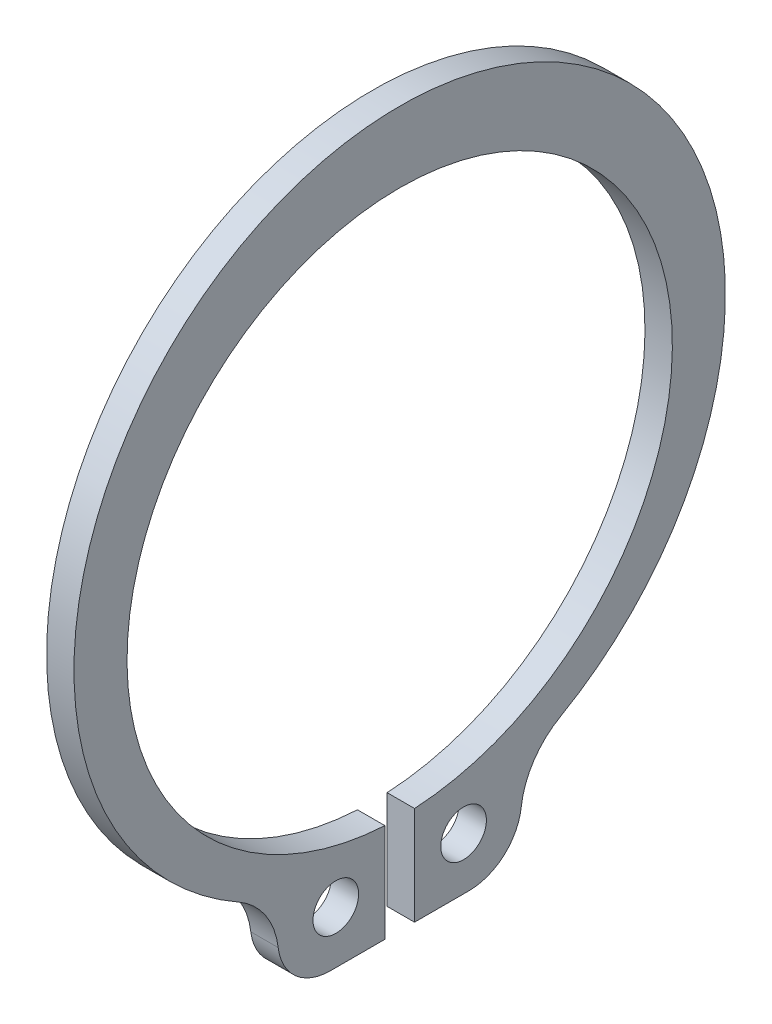
ISO-10303-21;
HEADER;
FILE_DESCRIPTION(('STEP AP214'),'2;1');
FILE_NAME('part.step','',(''),(''),'','','');
FILE_SCHEMA(('AUTOMOTIVE_DESIGN { 1 0 10303 214 1 1 1 1 }'));
ENDSEC;
DATA;
#1=APPLICATION_CONTEXT('core data for automotive mechanical design processes');
#2=APPLICATION_PROTOCOL_DEFINITION('international standard','automotive_design',2000,#1);
#3=PRODUCT_CONTEXT('',#1,'mechanical');
#4=PRODUCT('Part','Part','',(#3));
#5=PRODUCT_RELATED_PRODUCT_CATEGORY('part','',(#4));
#6=PRODUCT_DEFINITION_FORMATION('','',#4);
#7=PRODUCT_DEFINITION_CONTEXT('part definition',#1,'design');
#8=PRODUCT_DEFINITION('design','',#6,#7);
#9=PRODUCT_DEFINITION_SHAPE('','',#8);
#10=(LENGTH_UNIT() NAMED_UNIT(*) SI_UNIT(.MILLI.,.METRE.));
#11=(NAMED_UNIT(*) PLANE_ANGLE_UNIT() SI_UNIT($,.RADIAN.));
#12=(NAMED_UNIT(*) SI_UNIT($,.STERADIAN.) SOLID_ANGLE_UNIT());
#13=UNCERTAINTY_MEASURE_WITH_UNIT(LENGTH_MEASURE(1.E-05),#10,'distance_accuracy_value','');
#14=(GEOMETRIC_REPRESENTATION_CONTEXT(3) GLOBAL_UNCERTAINTY_ASSIGNED_CONTEXT((#13)) GLOBAL_UNIT_ASSIGNED_CONTEXT((#10,
#11,#12)) REPRESENTATION_CONTEXT('',''));
#15=CARTESIAN_POINT('',(0.,0.,0.));
#16=DIRECTION('',(0.,0.,1.));
#17=DIRECTION('',(1.,0.,0.));
#18=AXIS2_PLACEMENT_3D('',#15,#16,#17);
#19=CARTESIAN_POINT('',(-0.6,-14.6397048301289,-8.74999999999999));
#20=DIRECTION('',(1.,0.,0.));
#21=DIRECTION('',(0.,0.,-1.));
#22=AXIS2_PLACEMENT_3D('',#19,#20,#21);
#23=PLANE('',#22);
#24=CARTESIAN_POINT('',(-0.6,-13.95,2.8));
#25=DIRECTION('',(1.,0.,0.));
#26=DIRECTION('',(0.,0.,-1.));
#27=AXIS2_PLACEMENT_3D('',#24,#25,#26);
#28=CIRCLE('',#27,1.);
#29=CARTESIAN_POINT('',(-0.6,-13.95,1.8));
#30=VERTEX_POINT('',#29);
#31=EDGE_CURVE('E161',#30,#30,#28,.T.);
#32=ORIENTED_EDGE('',*,*,#31,.T.);
#33=EDGE_LOOP('',(#32));
#34=FACE_BOUND('',#33,.T.);
#35=CARTESIAN_POINT('',(-0.6,-13.95,-3.04151445238785));
#36=DIRECTION('',(1.,0.,0.));
#37=DIRECTION('',(0.,0.,-1.));
#38=AXIS2_PLACEMENT_3D('',#35,#36,#37);
#39=CIRCLE('',#38,2.29999999999999);
#40=CARTESIAN_POINT('',(-0.6,-16.25,-3.04151445238785));
#41=VERTEX_POINT('',#40);
#42=CARTESIAN_POINT('',(-0.6,-14.2258819320516,-5.3249086714327));
#43=VERTEX_POINT('',#42);
#44=EDGE_CURVE('E117',#41,#43,#39,.T.);
#45=ORIENTED_EDGE('',*,*,#44,.F.);
#46=DIRECTION('',(0.,0.,1.));
#47=VECTOR('',#46,1.);
#48=CARTESIAN_POINT('',(-0.6,-16.25,-0.65));
#49=LINE('',#48,#47);
#50=CARTESIAN_POINT('',(-0.6,-16.25,-0.65));
#51=VERTEX_POINT('',#50);
#52=EDGE_CURVE('E114',#41,#51,#49,.T.);
#53=ORIENTED_EDGE('',*,*,#52,.T.);
#54=DIRECTION('',(0.,1.,0.));
#55=VECTOR('',#54,1.);
#56=CARTESIAN_POINT('',(-0.6,-11.9323090808108,-0.65));
#57=LINE('',#56,#55);
#58=CARTESIAN_POINT('',(-0.6,-11.9323090808108,-0.65));
#59=VERTEX_POINT('',#58);
#60=EDGE_CURVE('E121',#51,#59,#57,.T.);
#61=ORIENTED_EDGE('',*,*,#60,.T.);
#62=CARTESIAN_POINT('',(-0.6,0.,0.));
#63=DIRECTION('',(1.,0.,0.));
#64=DIRECTION('',(0.,0.,-1.));
#65=AXIS2_PLACEMENT_3D('',#62,#63,#64);
#66=CIRCLE('',#65,11.95);
#67=CARTESIAN_POINT('',(-0.6,-11.9323090808108,0.650000000000002));
#68=VERTEX_POINT('',#67);
#69=EDGE_CURVE('E165',#59,#68,#66,.T.);
#70=ORIENTED_EDGE('',*,*,#69,.T.);
#71=DIRECTION('',(0.,-1.,0.));
#72=VECTOR('',#71,1.);
#73=CARTESIAN_POINT('',(-0.6,-16.25,0.65));
#74=LINE('',#73,#72);
#75=CARTESIAN_POINT('',(-0.6,-16.25,0.65));
#76=VERTEX_POINT('',#75);
#77=EDGE_CURVE('E127',#68,#76,#74,.T.);
#78=ORIENTED_EDGE('',*,*,#77,.T.);
#79=DIRECTION('',(0.,0.,1.));
#80=VECTOR('',#79,1.);
#81=CARTESIAN_POINT('',(-0.6,-16.25,3.04151445238785));
#82=LINE('',#81,#80);
#83=CARTESIAN_POINT('',(-0.6,-16.25,3.04151445238784));
#84=VERTEX_POINT('',#83);
#85=EDGE_CURVE('E134',#76,#84,#82,.T.);
#86=ORIENTED_EDGE('',*,*,#85,.T.);
#87=CARTESIAN_POINT('',(-0.6,-13.95,3.04151445238784));
#88=DIRECTION('',(1.,0.,0.));
#89=DIRECTION('',(0.,0.,-1.));
#90=AXIS2_PLACEMENT_3D('',#87,#88,#89);
#91=CIRCLE('',#90,2.3);
#92=CARTESIAN_POINT('',(-0.6,-14.2258819320516,5.3249086714327));
#93=VERTEX_POINT('',#92);
#94=EDGE_CURVE('E168',#93,#84,#91,.T.);
#95=ORIENTED_EDGE('',*,*,#94,.F.);
#96=CARTESIAN_POINT('',(-0.6,-14.6397048301289,8.75));
#97=DIRECTION('',(1.,0.,0.));
#98=DIRECTION('',(0.,0.,-1.));
#99=AXIS2_PLACEMENT_3D('',#96,#97,#98);
#100=CIRCLE('',#99,3.45);
#101=CARTESIAN_POINT('',(-0.6,-11.6393814640389,7.04689703808182));
#102=VERTEX_POINT('',#101);
#103=EDGE_CURVE('E93',#93,#102,#100,.T.);
#104=ORIENTED_EDGE('',*,*,#103,.T.);
#105=CARTESIAN_POINT('',(-0.6,0.775,0.));
#106=DIRECTION('',(1.,0.,0.));
#107=DIRECTION('',(0.,0.,-1.));
#108=AXIS2_PLACEMENT_3D('',#105,#106,#107);
#109=CIRCLE('',#108,14.275);
#110=CARTESIAN_POINT('',(-0.6,-11.6393815069315,-7.04689696251891));
#111=VERTEX_POINT('',#110);
#112=EDGE_CURVE('E87',#111,#102,#109,.T.);
#113=ORIENTED_EDGE('',*,*,#112,.F.);
#114=CARTESIAN_POINT('',(-0.6,-14.6397048301289,-8.74999999999999));
#115=DIRECTION('',(1.,0.,0.));
#116=DIRECTION('',(0.,0.,-1.));
#117=AXIS2_PLACEMENT_3D('',#114,#115,#116);
#118=CIRCLE('',#117,3.44999999999999);
#119=EDGE_CURVE('E90',#111,#43,#118,.T.);
#120=ORIENTED_EDGE('',*,*,#119,.T.);
#121=EDGE_LOOP('',(#45,#53,#61,#70,#78,#86,#95,#104,#113,#120));
#122=FACE_BOUND('',#121,.T.);
#123=CARTESIAN_POINT('',(-0.6,-13.95,-2.8));
#124=DIRECTION('',(1.,0.,0.));
#125=DIRECTION('',(0.,0.,-1.));
#126=AXIS2_PLACEMENT_3D('',#123,#124,#125);
#127=CIRCLE('',#126,1.);
#128=CARTESIAN_POINT('',(-0.6,-13.95,-3.8));
#129=VERTEX_POINT('',#128);
#130=EDGE_CURVE('E19',#129,#129,#127,.T.);
#131=ORIENTED_EDGE('',*,*,#130,.T.);
#132=EDGE_LOOP('',(#131));
#133=FACE_BOUND('',#132,.T.);
#134=ADVANCED_FACE('F16',(#34,#122,#133),#23,.F.);
#135=CARTESIAN_POINT('',(0.6,-13.95,-2.8));
#136=DIRECTION('',(1.,0.,0.));
#137=DIRECTION('',(0.,0.,-1.));
#138=AXIS2_PLACEMENT_3D('',#135,#136,#137);
#139=CYLINDRICAL_SURFACE('',#138,1.);
#140=ORIENTED_EDGE('',*,*,#130,.F.);
#141=EDGE_LOOP('',(#140));
#142=FACE_BOUND('',#141,.T.);
#143=CARTESIAN_POINT('',(0.6,-13.95,-2.8));
#144=DIRECTION('',(1.,0.,0.));
#145=DIRECTION('',(0.,0.,-1.));
#146=AXIS2_PLACEMENT_3D('',#143,#144,#145);
#147=CIRCLE('',#146,1.);
#148=CARTESIAN_POINT('',(0.6,-13.95,-3.8));
#149=VERTEX_POINT('',#148);
#150=EDGE_CURVE('E158',#149,#149,#147,.F.);
#151=ORIENTED_EDGE('',*,*,#150,.F.);
#152=EDGE_LOOP('',(#151));
#153=FACE_BOUND('',#152,.T.);
#154=ADVANCED_FACE('F326',(#142,#153),#139,.F.);
#155=CARTESIAN_POINT('',(0.6,-14.6397048301289,-8.74999999999999));
#156=DIRECTION('',(1.,0.,0.));
#157=DIRECTION('',(0.,0.,-1.));
#158=AXIS2_PLACEMENT_3D('',#155,#156,#157);
#159=CYLINDRICAL_SURFACE('',#158,3.44999999999999);
#160=DIRECTION('',(1.,0.,0.));
#161=VECTOR('',#160,1.);
#162=CARTESIAN_POINT('',(0.6,-11.639381549824,-7.046896886956));
#163=LINE('',#162,#161);
#164=CARTESIAN_POINT('',(0.6,-11.6393815069315,-7.04689696251891));
#165=VERTEX_POINT('',#164);
#166=EDGE_CURVE('E97',#165,#111,#163,.F.);
#167=ORIENTED_EDGE('',*,*,#166,.F.);
#168=CARTESIAN_POINT('',(0.6,-14.6397048301289,-8.74999999999999));
#169=DIRECTION('',(1.,0.,0.));
#170=DIRECTION('',(0.,0.,-1.));
#171=AXIS2_PLACEMENT_3D('',#168,#169,#170);
#172=CIRCLE('',#171,3.44999999999999);
#173=CARTESIAN_POINT('',(0.6,-14.2258819320516,-5.3249086714327));
#174=VERTEX_POINT('',#173);
#175=EDGE_CURVE('E156',#174,#165,#172,.F.);
#176=ORIENTED_EDGE('',*,*,#175,.F.);
#177=DIRECTION('',(1.,0.,0.));
#178=VECTOR('',#177,1.);
#179=CARTESIAN_POINT('',(0.6,-14.2258819320516,-5.3249086714327));
#180=LINE('',#179,#178);
#181=EDGE_CURVE('E103',#43,#174,#180,.T.);
#182=ORIENTED_EDGE('',*,*,#181,.F.);
#183=ORIENTED_EDGE('',*,*,#119,.F.);
#184=EDGE_LOOP('',(#167,#176,#182,#183));
#185=FACE_BOUND('',#184,.T.);
#186=ADVANCED_FACE('F100',(#185),#159,.F.);
#187=CARTESIAN_POINT('',(0.6,0.775,0.));
#188=DIRECTION('',(1.,0.,0.));
#189=DIRECTION('',(0.,0.,-1.));
#190=AXIS2_PLACEMENT_3D('',#187,#188,#189);
#191=CYLINDRICAL_SURFACE('',#190,14.275);
#192=CARTESIAN_POINT('',(0.6,0.775,0.));
#193=DIRECTION('',(1.,0.,0.));
#194=DIRECTION('',(0.,0.,-1.));
#195=AXIS2_PLACEMENT_3D('',#192,#193,#194);
#196=CIRCLE('',#195,14.275);
#197=CARTESIAN_POINT('',(0.6,-11.6393814640389,7.04689703808181));
#198=VERTEX_POINT('',#197);
#199=EDGE_CURVE('E107',#165,#198,#196,.T.);
#200=ORIENTED_EDGE('',*,*,#199,.F.);
#201=ORIENTED_EDGE('',*,*,#166,.T.);
#202=ORIENTED_EDGE('',*,*,#112,.T.);
#203=DIRECTION('',(1.,0.,0.));
#204=VECTOR('',#203,1.);
#205=CARTESIAN_POINT('',(0.6,-11.6393814640389,7.04689703808182));
#206=LINE('',#205,#204);
#207=EDGE_CURVE('E109',#102,#198,#206,.T.);
#208=ORIENTED_EDGE('',*,*,#207,.T.);
#209=EDGE_LOOP('',(#200,#201,#202,#208));
#210=FACE_BOUND('',#209,.T.);
#211=ADVANCED_FACE('F105',(#210),#191,.T.);
#212=CARTESIAN_POINT('',(0.6,-14.6397048301289,8.75));
#213=DIRECTION('',(1.,0.,0.));
#214=DIRECTION('',(0.,0.,-1.));
#215=AXIS2_PLACEMENT_3D('',#212,#213,#214);
#216=CYLINDRICAL_SURFACE('',#215,3.45);
#217=DIRECTION('',(1.,0.,0.));
#218=VECTOR('',#217,1.);
#219=CARTESIAN_POINT('',(0.6,-14.2258819320516,5.3249086714327));
#220=LINE('',#219,#218);
#221=CARTESIAN_POINT('',(0.6,-14.2258819320516,5.3249086714327));
#222=VERTEX_POINT('',#221);
#223=EDGE_CURVE('E170',#222,#93,#220,.F.);
#224=ORIENTED_EDGE('',*,*,#223,.F.);
#225=CARTESIAN_POINT('',(0.6,-14.6397048301289,8.75));
#226=DIRECTION('',(1.,0.,0.));
#227=DIRECTION('',(0.,0.,-1.));
#228=AXIS2_PLACEMENT_3D('',#225,#226,#227);
#229=CIRCLE('',#228,3.45);
#230=EDGE_CURVE('E152',#198,#222,#229,.F.);
#231=ORIENTED_EDGE('',*,*,#230,.F.);
#232=ORIENTED_EDGE('',*,*,#207,.F.);
#233=ORIENTED_EDGE('',*,*,#103,.F.);
#234=EDGE_LOOP('',(#224,#231,#232,#233));
#235=FACE_BOUND('',#234,.T.);
#236=ADVANCED_FACE('F300',(#235),#216,.F.);
#237=CARTESIAN_POINT('',(0.6,-13.95,3.04151445238784));
#238=DIRECTION('',(1.,0.,0.));
#239=DIRECTION('',(0.,0.,-1.));
#240=AXIS2_PLACEMENT_3D('',#237,#238,#239);
#241=CYLINDRICAL_SURFACE('',#240,2.3);
#242=CARTESIAN_POINT('',(0.6,-13.95,3.04151445238784));
#243=DIRECTION('',(1.,0.,0.));
#244=DIRECTION('',(0.,0.,-1.));
#245=AXIS2_PLACEMENT_3D('',#242,#243,#244);
#246=CIRCLE('',#245,2.3);
#247=CARTESIAN_POINT('',(0.6,-16.25,3.04151445238784));
#248=VERTEX_POINT('',#247);
#249=EDGE_CURVE('E148',#222,#248,#246,.T.);
#250=ORIENTED_EDGE('',*,*,#249,.F.);
#251=ORIENTED_EDGE('',*,*,#223,.T.);
#252=ORIENTED_EDGE('',*,*,#94,.T.);
#253=DIRECTION('',(1.,0.,0.));
#254=VECTOR('',#253,1.);
#255=CARTESIAN_POINT('',(0.6,-16.25,3.04151445238784));
#256=LINE('',#255,#254);
#257=EDGE_CURVE('E137',#84,#248,#256,.T.);
#258=ORIENTED_EDGE('',*,*,#257,.T.);
#259=EDGE_LOOP('',(#250,#251,#252,#258));
#260=FACE_BOUND('',#259,.T.);
#261=ADVANCED_FACE('F290',(#260),#241,.T.);
#262=CARTESIAN_POINT('',(0.6,-16.25,3.04151445238785));
#263=DIRECTION('',(0.,1.,0.));
#264=DIRECTION('',(0.,0.,1.));
#265=AXIS2_PLACEMENT_3D('',#262,#263,#264);
#266=PLANE('',#265);
#267=DIRECTION('',(1.,0.,0.));
#268=VECTOR('',#267,1.);
#269=CARTESIAN_POINT('',(0.6,-16.25,0.65));
#270=LINE('',#269,#268);
#271=CARTESIAN_POINT('',(0.6,-16.25,0.65));
#272=VERTEX_POINT('',#271);
#273=EDGE_CURVE('E131',#76,#272,#270,.T.);
#274=ORIENTED_EDGE('',*,*,#273,.T.);
#275=DIRECTION('',(0.,0.,-1.));
#276=VECTOR('',#275,1.);
#277=CARTESIAN_POINT('',(0.6,-16.25,-8.74999999999999));
#278=LINE('',#277,#276);
#279=EDGE_CURVE('E151',#248,#272,#278,.T.);
#280=ORIENTED_EDGE('',*,*,#279,.F.);
#281=ORIENTED_EDGE('',*,*,#257,.F.);
#282=ORIENTED_EDGE('',*,*,#85,.F.);
#283=EDGE_LOOP('',(#274,#280,#281,#282));
#284=FACE_BOUND('',#283,.T.);
#285=ADVANCED_FACE('F280',(#284),#266,.F.);
#286=CARTESIAN_POINT('',(0.6,-16.25,0.65));
#287=DIRECTION('',(0.,0.,1.));
#288=DIRECTION('',(0.,-1.,0.));
#289=AXIS2_PLACEMENT_3D('',#286,#287,#288);
#290=PLANE('',#289);
#291=DIRECTION('',(1.,0.,0.));
#292=VECTOR('',#291,1.);
#293=CARTESIAN_POINT('',(0.6,-11.9323090808108,0.650000000000005));
#294=LINE('',#293,#292);
#295=CARTESIAN_POINT('',(0.6,-11.9323090808108,0.650000000000002));
#296=VERTEX_POINT('',#295);
#297=EDGE_CURVE('E130',#68,#296,#294,.T.);
#298=ORIENTED_EDGE('',*,*,#297,.T.);
#299=DIRECTION('',(0.,1.,0.));
#300=VECTOR('',#299,1.);
#301=CARTESIAN_POINT('',(0.6,-14.6397048301289,0.65));
#302=LINE('',#301,#300);
#303=EDGE_CURVE('E147',#272,#296,#302,.T.);
#304=ORIENTED_EDGE('',*,*,#303,.F.);
#305=ORIENTED_EDGE('',*,*,#273,.F.);
#306=ORIENTED_EDGE('',*,*,#77,.F.);
#307=EDGE_LOOP('',(#298,#304,#305,#306));
#308=FACE_BOUND('',#307,.T.);
#309=ADVANCED_FACE('F270',(#308),#290,.F.);
#310=CARTESIAN_POINT('',(0.6,0.,0.));
#311=DIRECTION('',(1.,0.,0.));
#312=DIRECTION('',(0.,0.,-1.));
#313=AXIS2_PLACEMENT_3D('',#310,#311,#312);
#314=CYLINDRICAL_SURFACE('',#313,11.95);
#315=DIRECTION('',(-1.,0.,0.));
#316=VECTOR('',#315,1.);
#317=CARTESIAN_POINT('',(0.6,-11.9323090808108,-0.65));
#318=LINE('',#317,#316);
#319=CARTESIAN_POINT('',(0.6,-11.9323090808108,-0.650000000000006));
#320=VERTEX_POINT('',#319);
#321=EDGE_CURVE('E124',#59,#320,#318,.F.);
#322=ORIENTED_EDGE('',*,*,#321,.T.);
#323=CARTESIAN_POINT('',(0.6,0.,0.));
#324=DIRECTION('',(1.,0.,0.));
#325=DIRECTION('',(0.,0.,-1.));
#326=AXIS2_PLACEMENT_3D('',#323,#324,#325);
#327=CIRCLE('',#326,11.95);
#328=EDGE_CURVE('E143',#296,#320,#327,.F.);
#329=ORIENTED_EDGE('',*,*,#328,.F.);
#330=ORIENTED_EDGE('',*,*,#297,.F.);
#331=ORIENTED_EDGE('',*,*,#69,.F.);
#332=EDGE_LOOP('',(#322,#329,#330,#331));
#333=FACE_BOUND('',#332,.T.);
#334=ADVANCED_FACE('F261',(#333),#314,.F.);
#335=CARTESIAN_POINT('',(0.6,-11.9323090808108,-0.65));
#336=DIRECTION('',(0.,0.,-1.));
#337=DIRECTION('',(-1.,0.,0.));
#338=AXIS2_PLACEMENT_3D('',#335,#336,#337);
#339=PLANE('',#338);
#340=DIRECTION('',(1.,0.,0.));
#341=VECTOR('',#340,1.);
#342=CARTESIAN_POINT('',(0.6,-16.25,-0.65));
#343=LINE('',#342,#341);
#344=CARTESIAN_POINT('',(0.6,-16.25,-0.650000000000008));
#345=VERTEX_POINT('',#344);
#346=EDGE_CURVE('E118',#51,#345,#343,.T.);
#347=ORIENTED_EDGE('',*,*,#346,.T.);
#348=DIRECTION('',(0.,1.,0.));
#349=VECTOR('',#348,1.);
#350=CARTESIAN_POINT('',(0.6,-14.6397048301289,-0.650000000000012));
#351=LINE('',#350,#349);
#352=EDGE_CURVE('E146',#320,#345,#351,.F.);
#353=ORIENTED_EDGE('',*,*,#352,.F.);
#354=ORIENTED_EDGE('',*,*,#321,.F.);
#355=ORIENTED_EDGE('',*,*,#60,.F.);
#356=EDGE_LOOP('',(#347,#353,#354,#355));
#357=FACE_BOUND('',#356,.T.);
#358=ADVANCED_FACE('F211',(#357),#339,.F.);
#359=CARTESIAN_POINT('',(0.6,-16.25,-0.65));
#360=DIRECTION('',(0.,1.,0.));
#361=DIRECTION('',(0.,0.,1.));
#362=AXIS2_PLACEMENT_3D('',#359,#360,#361);
#363=PLANE('',#362);
#364=DIRECTION('',(1.,0.,0.));
#365=VECTOR('',#364,1.);
#366=CARTESIAN_POINT('',(0.6,-16.25,-3.04151445238785));
#367=LINE('',#366,#365);
#368=CARTESIAN_POINT('',(0.6,-16.25,-3.04151445238785));
#369=VERTEX_POINT('',#368);
#370=EDGE_CURVE('E34',#369,#41,#367,.F.);
#371=ORIENTED_EDGE('',*,*,#370,.F.);
#372=DIRECTION('',(0.,0.,-1.));
#373=VECTOR('',#372,1.);
#374=CARTESIAN_POINT('',(0.6,-16.25,-8.74999999999999));
#375=LINE('',#374,#373);
#376=EDGE_CURVE('E142',#345,#369,#375,.T.);
#377=ORIENTED_EDGE('',*,*,#376,.F.);
#378=ORIENTED_EDGE('',*,*,#346,.F.);
#379=ORIENTED_EDGE('',*,*,#52,.F.);
#380=EDGE_LOOP('',(#371,#377,#378,#379));
#381=FACE_BOUND('',#380,.T.);
#382=ADVANCED_FACE('F207',(#381),#363,.F.);
#383=CARTESIAN_POINT('',(0.6,-13.95,-3.04151445238785));
#384=DIRECTION('',(1.,0.,0.));
#385=DIRECTION('',(0.,0.,-1.));
#386=AXIS2_PLACEMENT_3D('',#383,#384,#385);
#387=CYLINDRICAL_SURFACE('',#386,2.29999999999999);
#388=CARTESIAN_POINT('',(0.6,-13.95,-3.04151445238785));
#389=DIRECTION('',(1.,0.,0.));
#390=DIRECTION('',(0.,0.,-1.));
#391=AXIS2_PLACEMENT_3D('',#388,#389,#390);
#392=CIRCLE('',#391,2.29999999999999);
#393=EDGE_CURVE('E25',#369,#174,#392,.T.);
#394=ORIENTED_EDGE('',*,*,#393,.F.);
#395=ORIENTED_EDGE('',*,*,#370,.T.);
#396=ORIENTED_EDGE('',*,*,#44,.T.);
#397=ORIENTED_EDGE('',*,*,#181,.T.);
#398=EDGE_LOOP('',(#394,#395,#396,#397));
#399=FACE_BOUND('',#398,.T.);
#400=ADVANCED_FACE('F214',(#399),#387,.T.);
#401=CARTESIAN_POINT('',(0.6,-13.95,2.8));
#402=DIRECTION('',(1.,0.,0.));
#403=DIRECTION('',(0.,0.,-1.));
#404=AXIS2_PLACEMENT_3D('',#401,#402,#403);
#405=CYLINDRICAL_SURFACE('',#404,1.);
#406=ORIENTED_EDGE('',*,*,#31,.F.);
#407=EDGE_LOOP('',(#406));
#408=FACE_BOUND('',#407,.T.);
#409=CARTESIAN_POINT('',(0.6,-13.95,2.8));
#410=DIRECTION('',(1.,0.,0.));
#411=DIRECTION('',(0.,0.,-1.));
#412=AXIS2_PLACEMENT_3D('',#409,#410,#411);
#413=CIRCLE('',#412,1.);
#414=CARTESIAN_POINT('',(0.6,-13.95,1.8));
#415=VERTEX_POINT('',#414);
#416=EDGE_CURVE('E11',#415,#415,#413,.F.);
#417=ORIENTED_EDGE('',*,*,#416,.F.);
#418=EDGE_LOOP('',(#417));
#419=FACE_BOUND('',#418,.T.);
#420=ADVANCED_FACE('F216',(#408,#419),#405,.F.);
#421=CARTESIAN_POINT('',(0.6,-14.6397048301289,-8.74999999999999));
#422=DIRECTION('',(1.,0.,0.));
#423=DIRECTION('',(0.,0.,-1.));
#424=AXIS2_PLACEMENT_3D('',#421,#422,#423);
#425=PLANE('',#424);
#426=ORIENTED_EDGE('',*,*,#416,.T.);
#427=EDGE_LOOP('',(#426));
#428=FACE_BOUND('',#427,.T.);
#429=ORIENTED_EDGE('',*,*,#376,.T.);
#430=ORIENTED_EDGE('',*,*,#393,.T.);
#431=ORIENTED_EDGE('',*,*,#175,.T.);
#432=ORIENTED_EDGE('',*,*,#199,.T.);
#433=ORIENTED_EDGE('',*,*,#230,.T.);
#434=ORIENTED_EDGE('',*,*,#249,.T.);
#435=ORIENTED_EDGE('',*,*,#279,.T.);
#436=ORIENTED_EDGE('',*,*,#303,.T.);
#437=ORIENTED_EDGE('',*,*,#328,.T.);
#438=ORIENTED_EDGE('',*,*,#352,.T.);
#439=EDGE_LOOP('',(#429,#430,#431,#432,#433,#434,#435,#436,#437,#438));
#440=FACE_BOUND('',#439,.T.);
#441=ORIENTED_EDGE('',*,*,#150,.T.);
#442=EDGE_LOOP('',(#441));
#443=FACE_BOUND('',#442,.T.);
#444=ADVANCED_FACE('F203',(#428,#440,#443),#425,.T.);
#445=CLOSED_SHELL('',(#134,#154,#186,#211,#236,#261,#285,#309,#334,#358,#382,#400,#420,#444));
#446=MANIFOLD_SOLID_BREP('B1',#445);
#447=ADVANCED_BREP_SHAPE_REPRESENTATION('',(#18,#446),#14);
#448=SHAPE_DEFINITION_REPRESENTATION(#9,#447);
ENDSEC;
END-ISO-10303-21;
